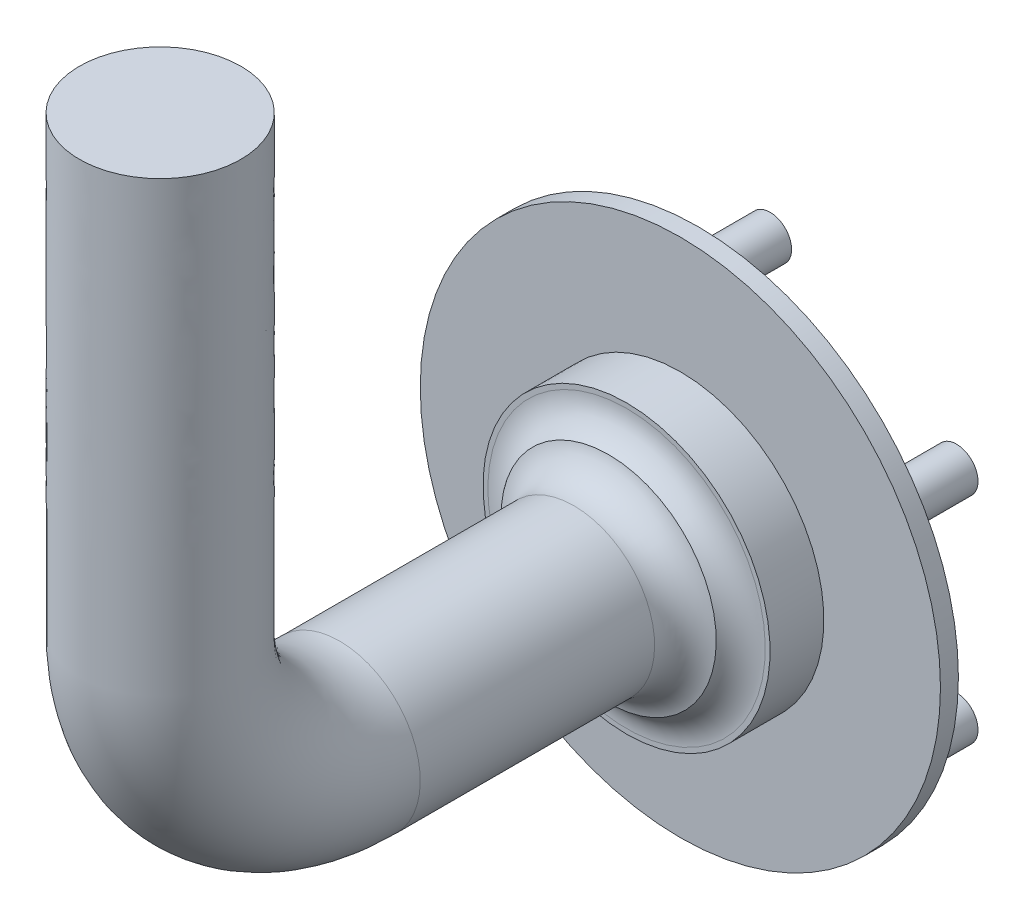
ISO-10303-21;
HEADER;
FILE_DESCRIPTION(('STEP AP214'),'2;1');
FILE_NAME('part.step','',(''),(''),'','','');
FILE_SCHEMA(('AUTOMOTIVE_DESIGN { 1 0 10303 214 1 1 1 1 }'));
ENDSEC;
DATA;
#1=APPLICATION_CONTEXT('core data for automotive mechanical design processes');
#2=APPLICATION_PROTOCOL_DEFINITION('international standard','automotive_design',2000,#1);
#3=PRODUCT_CONTEXT('',#1,'mechanical');
#4=PRODUCT('Part','Part','',(#3));
#5=PRODUCT_RELATED_PRODUCT_CATEGORY('part','',(#4));
#6=PRODUCT_DEFINITION_FORMATION('','',#4);
#7=PRODUCT_DEFINITION_CONTEXT('part definition',#1,'design');
#8=PRODUCT_DEFINITION('design','',#6,#7);
#9=PRODUCT_DEFINITION_SHAPE('','',#8);
#10=(LENGTH_UNIT() NAMED_UNIT(*) SI_UNIT(.MILLI.,.METRE.));
#11=(NAMED_UNIT(*) PLANE_ANGLE_UNIT() SI_UNIT($,.RADIAN.));
#12=(NAMED_UNIT(*) SI_UNIT($,.STERADIAN.) SOLID_ANGLE_UNIT());
#13=UNCERTAINTY_MEASURE_WITH_UNIT(LENGTH_MEASURE(1.E-05),#10,'distance_accuracy_value','');
#14=(GEOMETRIC_REPRESENTATION_CONTEXT(3) GLOBAL_UNCERTAINTY_ASSIGNED_CONTEXT((#13)) GLOBAL_UNIT_ASSIGNED_CONTEXT((#10,
#11,#12)) REPRESENTATION_CONTEXT('',''));
#15=CARTESIAN_POINT('',(0.,0.,0.));
#16=DIRECTION('',(0.,0.,1.));
#17=DIRECTION('',(1.,0.,0.));
#18=AXIS2_PLACEMENT_3D('',#15,#16,#17);
#19=CARTESIAN_POINT('',(0.,125.,50.));
#20=DIRECTION('',(0.,-1.,0.));
#21=DIRECTION('',(0.,0.,-1.));
#22=AXIS2_PLACEMENT_3D('',#19,#20,#21);
#23=PLANE('',#22);
#24=CARTESIAN_POINT('',(0.,125.,50.));
#25=DIRECTION('',(0.,-1.,0.));
#26=DIRECTION('',(0.,0.,-1.));
#27=AXIS2_PLACEMENT_3D('',#24,#25,#26);
#28=CIRCLE('',#27,22.5);
#29=CARTESIAN_POINT('',(0.,125.,27.5));
#30=VERTEX_POINT('',#29);
#31=EDGE_CURVE('E49',#30,#30,#28,.T.);
#32=ORIENTED_EDGE('',*,*,#31,.F.);
#33=EDGE_LOOP('',(#32));
#34=FACE_BOUND('',#33,.T.);
#35=ADVANCED_FACE('F32',(#34),#23,.F.);
#36=CARTESIAN_POINT('',(0.,125.,27.5));
#37=CARTESIAN_POINT('',(0.,104.166666666646,27.5));
#38=CARTESIAN_POINT('',(0.,83.3333333336014,27.5));
#39=CARTESIAN_POINT('',(0.,52.0833333331993,27.5));
#40=CARTESIAN_POINT('',(0.,41.6666666667103,27.5));
#41=CARTESIAN_POINT('',(0.,26.0416666666448,27.5));
#42=CARTESIAN_POINT('',(0.,20.8333333333371,27.5));
#43=CARTESIAN_POINT('',(0.,13.0208333333314,27.5));
#44=CARTESIAN_POINT('',(0.,10.4166666666652,27.5));
#45=CARTESIAN_POINT('',(0.,6.5104166666674,27.5));
#46=CARTESIAN_POINT('',(0.,5.20833333333313,27.5));
#47=CARTESIAN_POINT('',(0.,3.25520833333341,27.5));
#48=CARTESIAN_POINT('',(0.,2.60416666666628,27.5));
#49=CARTESIAN_POINT('',(0.,1.62760416666674,27.5));
#50=CARTESIAN_POINT('',(0.,1.30208333333319,27.5));
#51=CARTESIAN_POINT('',(0.,0.813802083333339,27.5));
#52=CARTESIAN_POINT('',(0.,0.651041666666746,27.5));
#53=CARTESIAN_POINT('',(0.,0.406901041666572,27.5));
#54=CARTESIAN_POINT('',(0.,0.325520833333337,27.5));
#55=CARTESIAN_POINT('',(0.,0.162760416666771,27.5));
#56=CARTESIAN_POINT('',(0.,0.0630696610081625,27.5000002237956));
#57=CARTESIAN_POINT('',(0.,-0.0396278367375316,27.4999998593851));
#58=CARTESIAN_POINT('',(0.,-0.0562458758030707,27.4999568598614));
#59=CARTESIAN_POINT('',(0.,-0.112491243460887,27.4997843012076));
#60=CARTESIAN_POINT('',(0.,-0.140613716436778,27.4996548826914));
#61=CARTESIAN_POINT('',(0.,-0.224980128554669,27.4991372133619));
#62=CARTESIAN_POINT('',(0.,-0.281223061212206,27.4986195484442));
#63=CARTESIAN_POINT('',(0.,-0.449944828544773,27.4965489393172));
#64=CARTESIAN_POINT('',(0.,-0.562416637010949,27.4944783753586));
#65=CARTESIAN_POINT('',(0.,-0.899779756035879,27.4861967324897));
#66=CARTESIAN_POINT('',(0.,-1.12461882110651,27.4779156101467));
#67=CARTESIAN_POINT('',(0.,-1.79873102724539,27.4447995397383));
#68=CARTESIAN_POINT('',(0.,-2.24759984205313,27.4116902453204));
#69=CARTESIAN_POINT('',(0.,-3.59099062462894,27.2793814987766));
#70=CARTESIAN_POINT('',(0.,-4.4822968534145,27.1471725723246));
#71=CARTESIAN_POINT('',(0.,-7.13035785950153,26.6204404886174));
#72=CARTESIAN_POINT('',(0.,-8.86093063837766,26.0954678623725));
#73=CARTESIAN_POINT('',(0.,-13.8495218933645,24.0291257074362));
#74=CARTESIAN_POINT('',(0.,-16.900034850488,21.9908381147607));
#75=CARTESIAN_POINT('',(0.,-21.9908381147721,16.9000348504994));
#76=CARTESIAN_POINT('',(0.,-24.0291257074362,13.8495218934043));
#77=CARTESIAN_POINT('',(0.,-26.0954678623725,8.86093063835785));
#78=CARTESIAN_POINT('',(0.,-26.6204404886285,7.13035785951691));
#79=CARTESIAN_POINT('',(0.,-27.147172572319,4.48229685340696));
#80=CARTESIAN_POINT('',(0.,-27.2793814987766,3.59099062464958));
#81=CARTESIAN_POINT('',(0.,-27.4116902453204,2.24759984204291));
#82=CARTESIAN_POINT('',(0.,-27.4447995397379,1.79873102724256));
#83=CARTESIAN_POINT('',(0.,-27.4779156101469,1.12461882110789));
#84=CARTESIAN_POINT('',(0.,-27.4861967324897,0.899779756033261));
#85=CARTESIAN_POINT('',(0.,-27.4944783753586,0.562416637012184));
#86=CARTESIAN_POINT('',(0.,-27.4965489393171,0.44994482854643));
#87=CARTESIAN_POINT('',(0.,-27.4986195484442,0.281223061211257));
#88=CARTESIAN_POINT('',(0.,-27.4991372133619,0.224980128555284));
#89=CARTESIAN_POINT('',(0.,-27.4996548826914,0.140613716436462));
#90=CARTESIAN_POINT('',(0.,-27.4997843012075,0.112491243461172));
#91=CARTESIAN_POINT('',(0.,-27.4999568598615,0.0562458758027345));
#92=CARTESIAN_POINT('',(0.,-27.5,0.0396278370203778));
#93=CARTESIAN_POINT('',(0.,-27.5,0.));
#94=CARTESIAN_POINT('',(45.,125.,27.5));
#95=CARTESIAN_POINT('',(45.,104.166666666646,27.5));
#96=CARTESIAN_POINT('',(45.,83.3333333336014,27.5));
#97=CARTESIAN_POINT('',(45.,52.0833333331993,27.5));
#98=CARTESIAN_POINT('',(45.,41.6666666667103,27.5));
#99=CARTESIAN_POINT('',(45.,26.0416666666448,27.5));
#100=CARTESIAN_POINT('',(45.,20.8333333333371,27.5));
#101=CARTESIAN_POINT('',(45.,13.0208333333314,27.5));
#102=CARTESIAN_POINT('',(45.,10.4166666666652,27.5));
#103=CARTESIAN_POINT('',(45.,6.5104166666674,27.5));
#104=CARTESIAN_POINT('',(45.,5.20833333333313,27.5));
#105=CARTESIAN_POINT('',(45.,3.25520833333341,27.5));
#106=CARTESIAN_POINT('',(45.,2.60416666666628,27.5));
#107=CARTESIAN_POINT('',(45.,1.62760416666674,27.5));
#108=CARTESIAN_POINT('',(45.,1.30208333333319,27.5));
#109=CARTESIAN_POINT('',(45.,0.813802083333339,27.5));
#110=CARTESIAN_POINT('',(45.,0.651041666666746,27.5));
#111=CARTESIAN_POINT('',(45.,0.406901041666572,27.5));
#112=CARTESIAN_POINT('',(45.,0.325520833333337,27.5));
#113=CARTESIAN_POINT('',(45.,0.162760416666771,27.5));
#114=CARTESIAN_POINT('',(45.,0.0630696610081625,27.5000002237956));
#115=CARTESIAN_POINT('',(45.,-0.0396278367375316,27.4999998593851));
#116=CARTESIAN_POINT('',(45.,-0.0562458758030707,27.4999568598614));
#117=CARTESIAN_POINT('',(45.,-0.112491243460887,27.4997843012076));
#118=CARTESIAN_POINT('',(45.,-0.140613716436778,27.4996548826914));
#119=CARTESIAN_POINT('',(45.,-0.22498012855467,27.4991372133619));
#120=CARTESIAN_POINT('',(45.,-0.281223061212206,27.4986195484442));
#121=CARTESIAN_POINT('',(45.,-0.449944828544773,27.4965489393172));
#122=CARTESIAN_POINT('',(45.,-0.562416637010949,27.4944783753586));
#123=CARTESIAN_POINT('',(45.,-0.899779756035879,27.4861967324897));
#124=CARTESIAN_POINT('',(45.,-1.12461882110651,27.4779156101467));
#125=CARTESIAN_POINT('',(45.,-1.79873102724539,27.4447995397383));
#126=CARTESIAN_POINT('',(45.,-2.24759984205313,27.4116902453204));
#127=CARTESIAN_POINT('',(45.,-3.59099062462894,27.2793814987766));
#128=CARTESIAN_POINT('',(45.,-4.4822968534145,27.1471725723246));
#129=CARTESIAN_POINT('',(45.,-7.13035785950153,26.6204404886174));
#130=CARTESIAN_POINT('',(45.,-8.86093063837766,26.0954678623725));
#131=CARTESIAN_POINT('',(45.,-13.8495218933645,24.0291257074362));
#132=CARTESIAN_POINT('',(45.,-16.900034850488,21.9908381147607));
#133=CARTESIAN_POINT('',(45.,-21.9908381147721,16.9000348504994));
#134=CARTESIAN_POINT('',(45.,-24.0291257074362,13.8495218934043));
#135=CARTESIAN_POINT('',(45.,-26.0954678623725,8.86093063835785));
#136=CARTESIAN_POINT('',(45.,-26.6204404886285,7.13035785951691));
#137=CARTESIAN_POINT('',(45.,-27.147172572319,4.48229685340696));
#138=CARTESIAN_POINT('',(45.,-27.2793814987766,3.59099062464958));
#139=CARTESIAN_POINT('',(45.,-27.4116902453204,2.24759984204291));
#140=CARTESIAN_POINT('',(45.,-27.4447995397379,1.79873102724256));
#141=CARTESIAN_POINT('',(45.,-27.4779156101469,1.12461882110789));
#142=CARTESIAN_POINT('',(45.,-27.4861967324897,0.899779756033261));
#143=CARTESIAN_POINT('',(45.,-27.4944783753586,0.562416637012184));
#144=CARTESIAN_POINT('',(45.,-27.4965489393171,0.44994482854643));
#145=CARTESIAN_POINT('',(45.,-27.4986195484442,0.281223061211257));
#146=CARTESIAN_POINT('',(45.,-27.4991372133619,0.224980128555284));
#147=CARTESIAN_POINT('',(45.,-27.4996548826914,0.140613716436462));
#148=CARTESIAN_POINT('',(45.,-27.4997843012075,0.112491243461172));
#149=CARTESIAN_POINT('',(45.,-27.4999568598615,0.0562458758027345));
#150=CARTESIAN_POINT('',(45.,-27.5,0.0396278370203778));
#151=CARTESIAN_POINT('',(45.,-27.5,0.));
#152=CARTESIAN_POINT('',(45.,125.,72.5));
#153=CARTESIAN_POINT('',(45.,104.166666666646,72.5));
#154=CARTESIAN_POINT('',(45.,83.3333333336014,72.5));
#155=CARTESIAN_POINT('',(45.,52.0833333331993,72.5));
#156=CARTESIAN_POINT('',(45.,41.6666666666742,72.5));
#157=CARTESIAN_POINT('',(45.,26.0416666666629,72.5));
#158=CARTESIAN_POINT('',(45.,20.8333333333371,72.5));
#159=CARTESIAN_POINT('',(45.,13.0208333333314,72.5));
#160=CARTESIAN_POINT('',(45.,10.4166666666674,72.5));
#161=CARTESIAN_POINT('',(45.,6.51041666666628,72.5));
#162=CARTESIAN_POINT('',(45.,5.20833333333314,72.5));
#163=CARTESIAN_POINT('',(45.,3.25520833333342,72.5));
#164=CARTESIAN_POINT('',(45.,2.60416666666615,72.5));
#165=CARTESIAN_POINT('',(45.,1.62760416666682,72.5));
#166=CARTESIAN_POINT('',(45.,1.30208333333323,72.5));
#167=CARTESIAN_POINT('',(45.,0.813802083333327,72.5));
#168=CARTESIAN_POINT('',(45.,0.651041666666743,72.5));
#169=CARTESIAN_POINT('',(45.,0.406901041666582,72.5));
#170=CARTESIAN_POINT('',(45.,0.325520833333343,72.5));
#171=CARTESIAN_POINT('',(45.,0.162760416666776,72.5));
#172=CARTESIAN_POINT('',(45.,0.0996907540215186,72.5000005900065));
#173=CARTESIAN_POINT('',(45.,-0.0626375480929595,72.499999629288));
#174=CARTESIAN_POINT('',(45.,-0.148284581662631,72.4998862669074));
#175=CARTESIAN_POINT('',(45.,-0.296567823669602,72.4994313395471));
#176=CARTESIAN_POINT('',(45.,-0.370708888787859,72.4990901452775));
#177=CARTESIAN_POINT('',(45.,-0.593129429825936,72.497725380681));
#178=CARTESIAN_POINT('',(45.,-0.741406252286714,72.4963606277158));
#179=CARTESIAN_POINT('',(45.,-1.1862181843453,72.49090174911));
#180=CARTESIAN_POINT('',(45.,-1.48273477030158,72.4854429895818));
#181=CARTESIAN_POINT('',(45.,-2.37214662954913,72.4636095674724));
#182=CARTESIAN_POINT('',(45.,-2.96490416473525,72.4417775176572));
#183=CARTESIAN_POINT('',(45.,-4.7421090718289,72.3544715138601));
#184=CARTESIAN_POINT('',(45.,-5.92549049268547,72.2671833740261));
#185=CARTESIAN_POINT('',(45.,-9.46715710129454,71.9183694058665));
#186=CARTESIAN_POINT('',(45.,-11.816964431729,71.5698185997544));
#187=CARTESIAN_POINT('',(45.,-18.7982161750497,70.1811612881938));
#188=CARTESIAN_POINT('',(45.,-23.3606353193644,68.7971425462548));
#189=CARTESIAN_POINT('',(45.,-36.5123759006778,63.3495132286954));
#190=CARTESIAN_POINT('',(45.,-44.5546373331038,57.9758459389002));
#191=CARTESIAN_POINT('',(45.,-57.9758459389456,44.5546373331492));
#192=CARTESIAN_POINT('',(45.,-63.3495132286953,36.5123759007801));
#193=CARTESIAN_POINT('',(45.,-68.7971425462548,23.3606353193135));
#194=CARTESIAN_POINT('',(45.,-70.1811612882081,18.7982161750888));
#195=CARTESIAN_POINT('',(45.,-71.5698185997472,11.8169644317099));
#196=CARTESIAN_POINT('',(45.,-71.9183694058664,9.46715710134794));
#197=CARTESIAN_POINT('',(45.,-72.267183374026,5.92549049265907));
#198=CARTESIAN_POINT('',(45.,-72.3544715138592,4.74210907182144));
#199=CARTESIAN_POINT('',(45.,-72.4417775176577,2.96490416473892));
#200=CARTESIAN_POINT('',(45.,-72.4636095674724,2.37214662954229));
#201=CARTESIAN_POINT('',(45.,-72.4854429895818,1.48273477030484));
#202=CARTESIAN_POINT('',(45.,-72.49090174911,1.18621818434969));
#203=CARTESIAN_POINT('',(45.,-72.4963606277159,0.74140625228423));
#204=CARTESIAN_POINT('',(45.,-72.497725380681,0.593129429827581));
#205=CARTESIAN_POINT('',(45.,-72.4990901452775,0.370708888787045));
#206=CARTESIAN_POINT('',(45.,-72.4994313395471,0.296567823670372));
#207=CARTESIAN_POINT('',(45.,-72.4998862669074,0.148284581661765));
#208=CARTESIAN_POINT('',(45.,-72.5,0.0626375488386688));
#209=CARTESIAN_POINT('',(45.,-72.5,0.));
#210=CARTESIAN_POINT('',(0.,125.,72.5));
#211=CARTESIAN_POINT('',(0.,104.166666666646,72.5));
#212=CARTESIAN_POINT('',(0.,83.3333333336014,72.5));
#213=CARTESIAN_POINT('',(0.,52.0833333331993,72.5));
#214=CARTESIAN_POINT('',(0.,41.6666666666742,72.5));
#215=CARTESIAN_POINT('',(0.,26.0416666666629,72.5));
#216=CARTESIAN_POINT('',(0.,20.8333333333371,72.5));
#217=CARTESIAN_POINT('',(0.,13.0208333333314,72.5));
#218=CARTESIAN_POINT('',(0.,10.4166666666674,72.5));
#219=CARTESIAN_POINT('',(0.,6.51041666666628,72.5));
#220=CARTESIAN_POINT('',(0.,5.20833333333314,72.5));
#221=CARTESIAN_POINT('',(0.,3.25520833333342,72.5));
#222=CARTESIAN_POINT('',(0.,2.60416666666615,72.5));
#223=CARTESIAN_POINT('',(0.,1.62760416666682,72.5));
#224=CARTESIAN_POINT('',(0.,1.30208333333323,72.5));
#225=CARTESIAN_POINT('',(0.,0.813802083333327,72.5));
#226=CARTESIAN_POINT('',(0.,0.651041666666743,72.5));
#227=CARTESIAN_POINT('',(0.,0.406901041666582,72.5));
#228=CARTESIAN_POINT('',(0.,0.325520833333343,72.5));
#229=CARTESIAN_POINT('',(0.,0.162760416666776,72.5));
#230=CARTESIAN_POINT('',(0.,0.0996907540215186,72.5000005900065));
#231=CARTESIAN_POINT('',(0.,-0.0626375480929595,72.499999629288));
#232=CARTESIAN_POINT('',(0.,-0.148284581662631,72.4998862669074));
#233=CARTESIAN_POINT('',(0.,-0.296567823669602,72.4994313395471));
#234=CARTESIAN_POINT('',(0.,-0.370708888787859,72.4990901452775));
#235=CARTESIAN_POINT('',(0.,-0.593129429825936,72.497725380681));
#236=CARTESIAN_POINT('',(0.,-0.741406252286714,72.4963606277158));
#237=CARTESIAN_POINT('',(0.,-1.1862181843453,72.49090174911));
#238=CARTESIAN_POINT('',(0.,-1.48273477030158,72.4854429895818));
#239=CARTESIAN_POINT('',(0.,-2.37214662954913,72.4636095674724));
#240=CARTESIAN_POINT('',(0.,-2.96490416473525,72.4417775176572));
#241=CARTESIAN_POINT('',(0.,-4.7421090718289,72.3544715138601));
#242=CARTESIAN_POINT('',(0.,-5.92549049268547,72.2671833740261));
#243=CARTESIAN_POINT('',(0.,-9.46715710129454,71.9183694058665));
#244=CARTESIAN_POINT('',(0.,-11.816964431729,71.5698185997544));
#245=CARTESIAN_POINT('',(0.,-18.7982161750497,70.1811612881938));
#246=CARTESIAN_POINT('',(0.,-23.3606353193644,68.7971425462548));
#247=CARTESIAN_POINT('',(0.,-36.5123759006778,63.3495132286954));
#248=CARTESIAN_POINT('',(0.,-44.5546373331038,57.9758459389002));
#249=CARTESIAN_POINT('',(0.,-57.9758459389456,44.5546373331492));
#250=CARTESIAN_POINT('',(0.,-63.3495132286953,36.5123759007801));
#251=CARTESIAN_POINT('',(0.,-68.7971425462548,23.3606353193135));
#252=CARTESIAN_POINT('',(0.,-70.1811612882081,18.7982161750888));
#253=CARTESIAN_POINT('',(0.,-71.5698185997472,11.8169644317099));
#254=CARTESIAN_POINT('',(0.,-71.9183694058664,9.46715710134794));
#255=CARTESIAN_POINT('',(0.,-72.267183374026,5.92549049265906));
#256=CARTESIAN_POINT('',(0.,-72.3544715138592,4.74210907182144));
#257=CARTESIAN_POINT('',(0.,-72.4417775176577,2.96490416473892));
#258=CARTESIAN_POINT('',(0.,-72.4636095674724,2.37214662954229));
#259=CARTESIAN_POINT('',(0.,-72.4854429895818,1.48273477030484));
#260=CARTESIAN_POINT('',(0.,-72.49090174911,1.18621818434969));
#261=CARTESIAN_POINT('',(0.,-72.4963606277159,0.74140625228423));
#262=CARTESIAN_POINT('',(0.,-72.497725380681,0.593129429827581));
#263=CARTESIAN_POINT('',(0.,-72.4990901452775,0.370708888787045));
#264=CARTESIAN_POINT('',(0.,-72.4994313395471,0.296567823670372));
#265=CARTESIAN_POINT('',(0.,-72.4998862669074,0.148284581661765));
#266=CARTESIAN_POINT('',(0.,-72.5,0.0626375488386688));
#267=CARTESIAN_POINT('',(0.,-72.5,0.));
#268=CARTESIAN_POINT('',(-45.,125.,72.5));
#269=CARTESIAN_POINT('',(-45.,104.166666666646,72.5));
#270=CARTESIAN_POINT('',(-45.,83.3333333336014,72.5));
#271=CARTESIAN_POINT('',(-45.,52.0833333331993,72.5));
#272=CARTESIAN_POINT('',(-45.,41.6666666666742,72.5));
#273=CARTESIAN_POINT('',(-45.,26.0416666666629,72.5));
#274=CARTESIAN_POINT('',(-45.,20.8333333333371,72.5));
#275=CARTESIAN_POINT('',(-45.,13.0208333333314,72.5));
#276=CARTESIAN_POINT('',(-45.,10.4166666666674,72.5));
#277=CARTESIAN_POINT('',(-45.,6.51041666666628,72.5));
#278=CARTESIAN_POINT('',(-45.,5.20833333333314,72.5));
#279=CARTESIAN_POINT('',(-45.,3.25520833333342,72.5));
#280=CARTESIAN_POINT('',(-45.,2.60416666666615,72.5));
#281=CARTESIAN_POINT('',(-45.,1.62760416666682,72.5));
#282=CARTESIAN_POINT('',(-45.,1.30208333333323,72.5));
#283=CARTESIAN_POINT('',(-45.,0.813802083333327,72.5));
#284=CARTESIAN_POINT('',(-45.,0.651041666666743,72.5));
#285=CARTESIAN_POINT('',(-45.,0.406901041666582,72.5));
#286=CARTESIAN_POINT('',(-45.,0.325520833333343,72.5));
#287=CARTESIAN_POINT('',(-45.,0.162760416666776,72.5));
#288=CARTESIAN_POINT('',(-45.,0.0996907540215186,72.5000005900065));
#289=CARTESIAN_POINT('',(-45.,-0.0626375480929595,72.499999629288));
#290=CARTESIAN_POINT('',(-45.,-0.148284581662631,72.4998862669074));
#291=CARTESIAN_POINT('',(-45.,-0.296567823669602,72.4994313395471));
#292=CARTESIAN_POINT('',(-45.,-0.370708888787859,72.4990901452775));
#293=CARTESIAN_POINT('',(-45.,-0.593129429825936,72.497725380681));
#294=CARTESIAN_POINT('',(-45.,-0.741406252286714,72.4963606277158));
#295=CARTESIAN_POINT('',(-45.,-1.1862181843453,72.49090174911));
#296=CARTESIAN_POINT('',(-45.,-1.48273477030158,72.4854429895818));
#297=CARTESIAN_POINT('',(-45.,-2.37214662954913,72.4636095674724));
#298=CARTESIAN_POINT('',(-45.,-2.96490416473525,72.4417775176572));
#299=CARTESIAN_POINT('',(-45.,-4.7421090718289,72.3544715138601));
#300=CARTESIAN_POINT('',(-45.,-5.92549049268547,72.2671833740261));
#301=CARTESIAN_POINT('',(-45.,-9.46715710129454,71.9183694058665));
#302=CARTESIAN_POINT('',(-45.,-11.816964431729,71.5698185997544));
#303=CARTESIAN_POINT('',(-45.,-18.7982161750497,70.1811612881938));
#304=CARTESIAN_POINT('',(-45.,-23.3606353193644,68.7971425462548));
#305=CARTESIAN_POINT('',(-45.,-36.5123759006778,63.3495132286954));
#306=CARTESIAN_POINT('',(-45.,-44.5546373331038,57.9758459389002));
#307=CARTESIAN_POINT('',(-45.,-57.9758459389456,44.5546373331492));
#308=CARTESIAN_POINT('',(-45.,-63.3495132286953,36.5123759007801));
#309=CARTESIAN_POINT('',(-45.,-68.7971425462548,23.3606353193135));
#310=CARTESIAN_POINT('',(-45.,-70.1811612882081,18.7982161750888));
#311=CARTESIAN_POINT('',(-45.,-71.5698185997472,11.8169644317099));
#312=CARTESIAN_POINT('',(-45.,-71.9183694058664,9.46715710134794));
#313=CARTESIAN_POINT('',(-45.,-72.267183374026,5.92549049265907));
#314=CARTESIAN_POINT('',(-45.,-72.3544715138592,4.74210907182144));
#315=CARTESIAN_POINT('',(-45.,-72.4417775176577,2.96490416473892));
#316=CARTESIAN_POINT('',(-45.,-72.4636095674724,2.37214662954229));
#317=CARTESIAN_POINT('',(-45.,-72.4854429895818,1.48273477030484));
#318=CARTESIAN_POINT('',(-45.,-72.49090174911,1.18621818434969));
#319=CARTESIAN_POINT('',(-45.,-72.4963606277159,0.74140625228423));
#320=CARTESIAN_POINT('',(-45.,-72.497725380681,0.593129429827581));
#321=CARTESIAN_POINT('',(-45.,-72.4990901452775,0.370708888787045));
#322=CARTESIAN_POINT('',(-45.,-72.4994313395471,0.296567823670372));
#323=CARTESIAN_POINT('',(-45.,-72.4998862669074,0.148284581661765));
#324=CARTESIAN_POINT('',(-45.,-72.5,0.0626375488386688));
#325=CARTESIAN_POINT('',(-45.,-72.5,0.));
#326=CARTESIAN_POINT('',(-45.,125.,27.5));
#327=CARTESIAN_POINT('',(-45.,104.166666666646,27.5));
#328=CARTESIAN_POINT('',(-45.,83.3333333336014,27.5));
#329=CARTESIAN_POINT('',(-45.,52.0833333331993,27.5));
#330=CARTESIAN_POINT('',(-45.,41.6666666667103,27.5));
#331=CARTESIAN_POINT('',(-45.,26.0416666666448,27.5));
#332=CARTESIAN_POINT('',(-45.,20.8333333333371,27.5));
#333=CARTESIAN_POINT('',(-45.,13.0208333333314,27.5));
#334=CARTESIAN_POINT('',(-45.,10.4166666666652,27.5));
#335=CARTESIAN_POINT('',(-45.,6.5104166666674,27.5));
#336=CARTESIAN_POINT('',(-45.,5.20833333333313,27.5));
#337=CARTESIAN_POINT('',(-45.,3.25520833333341,27.5));
#338=CARTESIAN_POINT('',(-45.,2.60416666666628,27.5));
#339=CARTESIAN_POINT('',(-45.,1.62760416666674,27.5));
#340=CARTESIAN_POINT('',(-45.,1.30208333333319,27.5));
#341=CARTESIAN_POINT('',(-45.,0.813802083333339,27.5));
#342=CARTESIAN_POINT('',(-45.,0.651041666666746,27.5));
#343=CARTESIAN_POINT('',(-45.,0.406901041666572,27.5));
#344=CARTESIAN_POINT('',(-45.,0.325520833333337,27.5));
#345=CARTESIAN_POINT('',(-45.,0.162760416666771,27.5));
#346=CARTESIAN_POINT('',(-45.,0.0630696610081625,27.5000002237956));
#347=CARTESIAN_POINT('',(-45.,-0.0396278367375316,27.4999998593851));
#348=CARTESIAN_POINT('',(-45.,-0.0562458758030707,27.4999568598614));
#349=CARTESIAN_POINT('',(-45.,-0.112491243460887,27.4997843012076));
#350=CARTESIAN_POINT('',(-45.,-0.140613716436778,27.4996548826914));
#351=CARTESIAN_POINT('',(-45.,-0.22498012855467,27.4991372133619));
#352=CARTESIAN_POINT('',(-45.,-0.281223061212206,27.4986195484442));
#353=CARTESIAN_POINT('',(-45.,-0.449944828544773,27.4965489393172));
#354=CARTESIAN_POINT('',(-45.,-0.562416637010949,27.4944783753586));
#355=CARTESIAN_POINT('',(-45.,-0.899779756035879,27.4861967324897));
#356=CARTESIAN_POINT('',(-45.,-1.12461882110651,27.4779156101467));
#357=CARTESIAN_POINT('',(-45.,-1.79873102724539,27.4447995397383));
#358=CARTESIAN_POINT('',(-45.,-2.24759984205313,27.4116902453204));
#359=CARTESIAN_POINT('',(-45.,-3.59099062462894,27.2793814987766));
#360=CARTESIAN_POINT('',(-45.,-4.4822968534145,27.1471725723246));
#361=CARTESIAN_POINT('',(-45.,-7.13035785950153,26.6204404886174));
#362=CARTESIAN_POINT('',(-45.,-8.86093063837766,26.0954678623725));
#363=CARTESIAN_POINT('',(-45.,-13.8495218933645,24.0291257074362));
#364=CARTESIAN_POINT('',(-45.,-16.900034850488,21.9908381147607));
#365=CARTESIAN_POINT('',(-45.,-21.9908381147721,16.9000348504994));
#366=CARTESIAN_POINT('',(-45.,-24.0291257074362,13.8495218934043));
#367=CARTESIAN_POINT('',(-45.,-26.0954678623725,8.86093063835785));
#368=CARTESIAN_POINT('',(-45.,-26.6204404886285,7.13035785951691));
#369=CARTESIAN_POINT('',(-45.,-27.147172572319,4.48229685340696));
#370=CARTESIAN_POINT('',(-45.,-27.2793814987766,3.59099062464958));
#371=CARTESIAN_POINT('',(-45.,-27.4116902453204,2.24759984204291));
#372=CARTESIAN_POINT('',(-45.,-27.4447995397379,1.79873102724256));
#373=CARTESIAN_POINT('',(-45.,-27.4779156101469,1.12461882110789));
#374=CARTESIAN_POINT('',(-45.,-27.4861967324897,0.899779756033261));
#375=CARTESIAN_POINT('',(-45.,-27.4944783753586,0.562416637012184));
#376=CARTESIAN_POINT('',(-45.,-27.4965489393171,0.44994482854643));
#377=CARTESIAN_POINT('',(-45.,-27.4986195484442,0.281223061211257));
#378=CARTESIAN_POINT('',(-45.,-27.4991372133619,0.224980128555284));
#379=CARTESIAN_POINT('',(-45.,-27.4996548826914,0.140613716436462));
#380=CARTESIAN_POINT('',(-45.,-27.4997843012075,0.112491243461172));
#381=CARTESIAN_POINT('',(-45.,-27.4999568598615,0.0562458758027345));
#382=CARTESIAN_POINT('',(-45.,-27.5,0.0396278370203778));
#383=CARTESIAN_POINT('',(-45.,-27.5,0.));
#384=CARTESIAN_POINT('',(0.,125.,27.5));
#385=CARTESIAN_POINT('',(0.,104.166666666646,27.5));
#386=CARTESIAN_POINT('',(0.,83.3333333336014,27.5));
#387=CARTESIAN_POINT('',(0.,52.0833333331993,27.5));
#388=CARTESIAN_POINT('',(0.,41.6666666667103,27.5));
#389=CARTESIAN_POINT('',(0.,26.0416666666448,27.5));
#390=CARTESIAN_POINT('',(0.,20.8333333333371,27.5));
#391=CARTESIAN_POINT('',(0.,13.0208333333314,27.5));
#392=CARTESIAN_POINT('',(0.,10.4166666666652,27.5));
#393=CARTESIAN_POINT('',(0.,6.5104166666674,27.5));
#394=CARTESIAN_POINT('',(0.,5.20833333333313,27.5));
#395=CARTESIAN_POINT('',(0.,3.25520833333341,27.5));
#396=CARTESIAN_POINT('',(0.,2.60416666666628,27.5));
#397=CARTESIAN_POINT('',(0.,1.62760416666674,27.5));
#398=CARTESIAN_POINT('',(0.,1.30208333333319,27.5));
#399=CARTESIAN_POINT('',(0.,0.813802083333339,27.5));
#400=CARTESIAN_POINT('',(0.,0.651041666666746,27.5));
#401=CARTESIAN_POINT('',(0.,0.406901041666572,27.5));
#402=CARTESIAN_POINT('',(0.,0.325520833333337,27.5));
#403=CARTESIAN_POINT('',(0.,0.162760416666771,27.5));
#404=CARTESIAN_POINT('',(0.,0.0630696610081625,27.5000002237956));
#405=CARTESIAN_POINT('',(0.,-0.0396278367375316,27.4999998593851));
#406=CARTESIAN_POINT('',(0.,-0.0562458758030707,27.4999568598614));
#407=CARTESIAN_POINT('',(0.,-0.112491243460887,27.4997843012076));
#408=CARTESIAN_POINT('',(0.,-0.140613716436778,27.4996548826914));
#409=CARTESIAN_POINT('',(0.,-0.224980128554669,27.4991372133619));
#410=CARTESIAN_POINT('',(0.,-0.281223061212206,27.4986195484442));
#411=CARTESIAN_POINT('',(0.,-0.449944828544773,27.4965489393172));
#412=CARTESIAN_POINT('',(0.,-0.562416637010949,27.4944783753586));
#413=CARTESIAN_POINT('',(0.,-0.899779756035879,27.4861967324897));
#414=CARTESIAN_POINT('',(0.,-1.12461882110651,27.4779156101467));
#415=CARTESIAN_POINT('',(0.,-1.79873102724539,27.4447995397383));
#416=CARTESIAN_POINT('',(0.,-2.24759984205313,27.4116902453204));
#417=CARTESIAN_POINT('',(0.,-3.59099062462894,27.2793814987766));
#418=CARTESIAN_POINT('',(0.,-4.4822968534145,27.1471725723246));
#419=CARTESIAN_POINT('',(0.,-7.13035785950153,26.6204404886174));
#420=CARTESIAN_POINT('',(0.,-8.86093063837766,26.0954678623725));
#421=CARTESIAN_POINT('',(0.,-13.8495218933645,24.0291257074362));
#422=CARTESIAN_POINT('',(0.,-16.900034850488,21.9908381147607));
#423=CARTESIAN_POINT('',(0.,-21.9908381147721,16.9000348504994));
#424=CARTESIAN_POINT('',(0.,-24.0291257074362,13.8495218934043));
#425=CARTESIAN_POINT('',(0.,-26.0954678623725,8.86093063835785));
#426=CARTESIAN_POINT('',(0.,-26.6204404886285,7.13035785951691));
#427=CARTESIAN_POINT('',(0.,-27.147172572319,4.48229685340696));
#428=CARTESIAN_POINT('',(0.,-27.2793814987766,3.59099062464958));
#429=CARTESIAN_POINT('',(0.,-27.4116902453204,2.24759984204291));
#430=CARTESIAN_POINT('',(0.,-27.4447995397379,1.79873102724256));
#431=CARTESIAN_POINT('',(0.,-27.4779156101469,1.12461882110789));
#432=CARTESIAN_POINT('',(0.,-27.4861967324897,0.899779756033261));
#433=CARTESIAN_POINT('',(0.,-27.4944783753586,0.562416637012184));
#434=CARTESIAN_POINT('',(0.,-27.4965489393171,0.44994482854643));
#435=CARTESIAN_POINT('',(0.,-27.4986195484442,0.281223061211257));
#436=CARTESIAN_POINT('',(0.,-27.4991372133619,0.224980128555284));
#437=CARTESIAN_POINT('',(0.,-27.4996548826914,0.140613716436462));
#438=CARTESIAN_POINT('',(0.,-27.4997843012075,0.112491243461172));
#439=CARTESIAN_POINT('',(0.,-27.4999568598615,0.0562458758027345));
#440=CARTESIAN_POINT('',(0.,-27.5,0.0396278370203778));
#441=CARTESIAN_POINT('',(0.,-27.5,0.));
#442=(BOUNDED_SURFACE() B_SPLINE_SURFACE(3,3,((#36,#37,#38,#39,#40,#41,#42,#43,#44,#45,#46,#47,
#48,#49,#50,#51,#52,#53,#54,#55,#56,#57,#58,#59,#60,#61,#62,#63,#64,#65,#66,#67,#68,#69,#70,#71,
#72,#73,#74,#75,#76,#77,#78,#79,#80,#81,#82,#83,#84,#85,#86,#87,#88,#89,#90,#91,#92,#93),(#94,
#95,#96,#97,#98,#99,#100,#101,#102,#103,#104,#105,#106,#107,#108,#109,#110,#111,#112,#113,#114,
#115,#116,#117,#118,#119,#120,#121,#122,#123,#124,#125,#126,#127,#128,#129,#130,#131,#132,#133,
#134,#135,#136,#137,#138,#139,#140,#141,#142,#143,#144,#145,#146,#147,#148,#149,#150,#151),
(#152,#153,#154,#155,#156,#157,#158,#159,#160,#161,#162,#163,#164,#165,#166,#167,#168,#169,#170,
#171,#172,#173,#174,#175,#176,#177,#178,#179,#180,#181,#182,#183,#184,#185,#186,#187,#188,#189,
#190,#191,#192,#193,#194,#195,#196,#197,#198,#199,#200,#201,#202,#203,#204,#205,#206,#207,#208,
#209),(#210,#211,#212,#213,#214,#215,#216,#217,#218,#219,#220,#221,#222,#223,#224,#225,#226,
#227,#228,#229,#230,#231,#232,#233,#234,#235,#236,#237,#238,#239,#240,#241,#242,#243,#244,#245,
#246,#247,#248,#249,#250,#251,#252,#253,#254,#255,#256,#257,#258,#259,#260,#261,#262,#263,#264,
#265,#266,#267),(#268,#269,#270,#271,#272,#273,#274,#275,#276,#277,#278,#279,#280,#281,#282,
#283,#284,#285,#286,#287,#288,#289,#290,#291,#292,#293,#294,#295,#296,#297,#298,#299,#300,#301,
#302,#303,#304,#305,#306,#307,#308,#309,#310,#311,#312,#313,#314,#315,#316,#317,#318,#319,#320,
#321,#322,#323,#324,#325),(#326,#327,#328,#329,#330,#331,#332,#333,#334,#335,#336,#337,#338,
#339,#340,#341,#342,#343,#344,#345,#346,#347,#348,#349,#350,#351,#352,#353,#354,#355,#356,#357,
#358,#359,#360,#361,#362,#363,#364,#365,#366,#367,#368,#369,#370,#371,#372,#373,#374,#375,#376,
#377,#378,#379,#380,#381,#382,#383),(#384,#385,#386,#387,#388,#389,#390,#391,#392,#393,#394,
#395,#396,#397,#398,#399,#400,#401,#402,#403,#404,#405,#406,#407,#408,#409,#410,#411,#412,#413,
#414,#415,#416,#417,#418,#419,#420,#421,#422,#423,#424,#425,#426,#427,#428,#429,#430,#431,#432,
#433,#434,#435,#436,#437,#438,#439,#440,#441)),.UNSPECIFIED.,.T.,.F.,
.F.) B_SPLINE_SURFACE_WITH_KNOTS((4,3,4),(4,2,2,2,2,2,2,2,2,2,2,2,2,2,2,2,2,2,2,2,2,2,2,2,2,2,2,
2,4),(0.,0.5,1.),(0.,0.224384437461417,0.336576656192125,0.392672765557479,0.420720820240157,
0.434744847581495,0.441756861252164,0.445262868087499,0.447015871505166,0.447892373214,
0.448768874922834,0.4493195971887,0.449870319454566,0.450971763986298,0.453174653049763,
0.457580431176692,0.46639198743055,0.484015099938267,0.5192613249537,0.589753774984567,
0.660246225015433,0.695492450030867,0.713115562538583,0.721927118792441,0.726332896919371,
0.728535785982835,0.729637230514568,0.730187952780434,0.7307386750463),
.UNSPECIFIED.) GEOMETRIC_REPRESENTATION_ITEM() RATIONAL_B_SPLINE_SURFACE(((1.,1.,1.,1.,1.,1.,1.,
1.,1.,1.,1.,1.,1.,1.,1.,1.,1.,1.,1.,1.,1.,1.,1.,1.,1.,1.,1.,1.,1.,1.,1.,1.,1.,1.,1.,1.,1.,1.,1.,
1.,1.,1.,1.,1.,1.,1.,1.,1.,1.,1.,1.,1.,1.,1.,1.,1.,1.,1.),(0.333333333333333,0.333333333333333,
0.333333333333333,0.333333333333333,0.333333333333333,0.333333333333333,0.333333333333333,
0.333333333333333,0.333333333333333,0.333333333333333,0.333333333333333,0.333333333333333,
0.333333333333333,0.333333333333333,0.333333333333333,0.333333333333333,0.333333333333333,
0.333333333333333,0.333333333333333,0.333333333333333,0.333333333333333,0.333333333333333,
0.333333333333333,0.333333333333333,0.333333333333333,0.333333333333333,0.333333333333333,
0.333333333333333,0.333333333333333,0.333333333333333,0.333333333333333,0.333333333333333,
0.333333333333333,0.333333333333333,0.333333333333333,0.333333333333333,0.333333333333333,
0.333333333333333,0.333333333333333,0.333333333333333,0.333333333333333,0.333333333333333,
0.333333333333333,0.333333333333333,0.333333333333333,0.333333333333333,0.333333333333333,
0.333333333333333,0.333333333333333,0.333333333333333,0.333333333333333,0.333333333333333,
0.333333333333333,0.333333333333333,0.333333333333333,0.333333333333333,0.333333333333333,
0.333333333333333),(0.333333333333333,0.333333333333333,0.333333333333333,0.333333333333333,
0.333333333333333,0.333333333333333,0.333333333333333,0.333333333333333,0.333333333333333,
0.333333333333333,0.333333333333333,0.333333333333333,0.333333333333333,0.333333333333333,
0.333333333333333,0.333333333333333,0.333333333333333,0.333333333333333,0.333333333333333,
0.333333333333333,0.333333333333333,0.333333333333333,0.333333333333333,0.333333333333333,
0.333333333333333,0.333333333333333,0.333333333333333,0.333333333333333,0.333333333333333,
0.333333333333333,0.333333333333333,0.333333333333333,0.333333333333333,0.333333333333333,
0.333333333333333,0.333333333333333,0.333333333333333,0.333333333333333,0.333333333333333,
0.333333333333333,0.333333333333333,0.333333333333333,0.333333333333333,0.333333333333333,
0.333333333333333,0.333333333333333,0.333333333333333,0.333333333333333,0.333333333333333,
0.333333333333333,0.333333333333333,0.333333333333333,0.333333333333333,0.333333333333333,
0.333333333333333,0.333333333333333,0.333333333333333,0.333333333333333),(1.,1.,1.,1.,1.,1.,1.,
1.,1.,1.,1.,1.,1.,1.,1.,1.,1.,1.,1.,1.,1.,1.,1.,1.,1.,1.,1.,1.,1.,1.,1.,1.,1.,1.,1.,1.,1.,1.,1.,
1.,1.,1.,1.,1.,1.,1.,1.,1.,1.,1.,1.,1.,1.,1.,1.,1.,1.,1.),(0.333333333333333,0.333333333333333,
0.333333333333333,0.333333333333333,0.333333333333333,0.333333333333333,0.333333333333333,
0.333333333333333,0.333333333333333,0.333333333333333,0.333333333333333,0.333333333333333,
0.333333333333333,0.333333333333333,0.333333333333333,0.333333333333333,0.333333333333333,
0.333333333333333,0.333333333333333,0.333333333333333,0.333333333333333,0.333333333333333,
0.333333333333333,0.333333333333333,0.333333333333333,0.333333333333333,0.333333333333333,
0.333333333333333,0.333333333333333,0.333333333333333,0.333333333333333,0.333333333333333,
0.333333333333333,0.333333333333333,0.333333333333333,0.333333333333333,0.333333333333333,
0.333333333333333,0.333333333333333,0.333333333333333,0.333333333333333,0.333333333333333,
0.333333333333333,0.333333333333333,0.333333333333333,0.333333333333333,0.333333333333333,
0.333333333333333,0.333333333333333,0.333333333333333,0.333333333333333,0.333333333333333,
0.333333333333333,0.333333333333333,0.333333333333333,0.333333333333333,0.333333333333333,
0.333333333333333),(0.333333333333333,0.333333333333333,0.333333333333333,0.333333333333333,
0.333333333333333,0.333333333333333,0.333333333333333,0.333333333333333,0.333333333333333,
0.333333333333333,0.333333333333333,0.333333333333333,0.333333333333333,0.333333333333333,
0.333333333333333,0.333333333333333,0.333333333333333,0.333333333333333,0.333333333333333,
0.333333333333333,0.333333333333333,0.333333333333333,0.333333333333333,0.333333333333333,
0.333333333333333,0.333333333333333,0.333333333333333,0.333333333333333,0.333333333333333,
0.333333333333333,0.333333333333333,0.333333333333333,0.333333333333333,0.333333333333333,
0.333333333333333,0.333333333333333,0.333333333333333,0.333333333333333,0.333333333333333,
0.333333333333333,0.333333333333333,0.333333333333333,0.333333333333333,0.333333333333333,
0.333333333333333,0.333333333333333,0.333333333333333,0.333333333333333,0.333333333333333,
0.333333333333333,0.333333333333333,0.333333333333333,0.333333333333333,0.333333333333333,
0.333333333333333,0.333333333333333,0.333333333333333,0.333333333333333),(1.,1.,1.,1.,1.,1.,1.,
1.,1.,1.,1.,1.,1.,1.,1.,1.,1.,1.,1.,1.,1.,1.,1.,1.,1.,1.,1.,1.,1.,1.,1.,1.,1.,1.,1.,1.,1.,1.,1.,
1.,1.,1.,1.,1.,1.,1.,1.,1.,1.,1.,1.,1.,1.,1.,1.,1.,1.,1.))) REPRESENTATION_ITEM('') SURFACE());
#443=CARTESIAN_POINT('',(0.,-50.,0.));
#444=DIRECTION('',(0.,0.,-1.));
#445=DIRECTION('',(0.,1.,0.));
#446=AXIS2_PLACEMENT_3D('',#443,#444,#445);
#447=CIRCLE('',#446,22.5);
#448=CARTESIAN_POINT('',(0.,-27.5,0.));
#449=VERTEX_POINT('',#448);
#450=EDGE_CURVE('E44',#449,#449,#447,.T.);
#451=ORIENTED_EDGE('',*,*,#450,.F.);
#452=EDGE_LOOP('',(#451));
#453=FACE_BOUND('',#452,.T.);
#454=ORIENTED_EDGE('',*,*,#31,.T.);
#455=EDGE_LOOP('',(#454));
#456=FACE_BOUND('',#455,.T.);
#457=ADVANCED_FACE('F145',(#453,#456),#442,.T.);
#458=CARTESIAN_POINT('',(0.,-50.,0.));
#459=DIRECTION('',(0.,0.,-1.));
#460=DIRECTION('',(-1.,0.,0.));
#461=AXIS2_PLACEMENT_3D('',#458,#459,#460);
#462=CYLINDRICAL_SURFACE('',#461,22.5);
#463=CARTESIAN_POINT('',(0.,-50.,-65.3175416344814));
#464=DIRECTION('',(0.,0.,-1.));
#465=DIRECTION('',(0.,1.,0.));
#466=AXIS2_PLACEMENT_3D('',#463,#464,#465);
#467=CIRCLE('',#466,22.5);
#468=CARTESIAN_POINT('',(0.,-27.5,-65.3175416344814));
#469=VERTEX_POINT('',#468);
#470=EDGE_CURVE('E10',#469,#469,#467,.F.);
#471=ORIENTED_EDGE('',*,*,#470,.T.);
#472=EDGE_LOOP('',(#471));
#473=FACE_BOUND('',#472,.T.);
#474=ORIENTED_EDGE('',*,*,#450,.T.);
#475=EDGE_LOOP('',(#474));
#476=FACE_BOUND('',#475,.T.);
#477=ADVANCED_FACE('F142',(#473,#476),#462,.T.);
#478=CARTESIAN_POINT('',(0.,-50.,-95.));
#479=DIRECTION('',(0.,0.,1.));
#480=DIRECTION('',(0.,-1.,0.));
#481=AXIS2_PLACEMENT_3D('',#478,#479,#480);
#482=CYLINDRICAL_SURFACE('',#481,40.);
#483=CARTESIAN_POINT('',(0.,-50.,-95.));
#484=DIRECTION('',(0.,0.,-1.));
#485=DIRECTION('',(0.,1.,0.));
#486=AXIS2_PLACEMENT_3D('',#483,#484,#485);
#487=CIRCLE('',#486,40.);
#488=CARTESIAN_POINT('',(0.,-10.,-95.));
#489=VERTEX_POINT('',#488);
#490=EDGE_CURVE('E52',#489,#489,#487,.T.);
#491=ORIENTED_EDGE('',*,*,#490,.F.);
#492=EDGE_LOOP('',(#491));
#493=FACE_BOUND('',#492,.T.);
#494=CARTESIAN_POINT('',(0.,-50.,-80.));
#495=DIRECTION('',(0.,0.,-1.));
#496=DIRECTION('',(0.,1.,0.));
#497=AXIS2_PLACEMENT_3D('',#494,#495,#496);
#498=CIRCLE('',#497,40.);
#499=CARTESIAN_POINT('',(0.,-10.,-80.));
#500=VERTEX_POINT('',#499);
#501=EDGE_CURVE('E53',#500,#500,#498,.T.);
#502=ORIENTED_EDGE('',*,*,#501,.T.);
#503=EDGE_LOOP('',(#502));
#504=FACE_BOUND('',#503,.T.);
#505=ADVANCED_FACE('F144',(#493,#504),#482,.T.);
#506=CARTESIAN_POINT('',(0.,-50.,-80.));
#507=DIRECTION('',(0.,0.,-1.));
#508=DIRECTION('',(0.,1.,0.));
#509=AXIS2_PLACEMENT_3D('',#506,#507,#508);
#510=PLANE('',#509);
#511=CARTESIAN_POINT('',(0.,-50.,-80.));
#512=DIRECTION('',(0.,0.,-1.));
#513=DIRECTION('',(0.,1.,0.));
#514=AXIS2_PLACEMENT_3D('',#511,#512,#513);
#515=CIRCLE('',#514,38.6602540378444);
#516=CARTESIAN_POINT('',(0.,-11.3397459621556,-80.));
#517=VERTEX_POINT('',#516);
#518=EDGE_CURVE('E40',#517,#517,#515,.T.);
#519=ORIENTED_EDGE('',*,*,#518,.T.);
#520=EDGE_LOOP('',(#519));
#521=FACE_BOUND('',#520,.T.);
#522=ORIENTED_EDGE('',*,*,#501,.F.);
#523=EDGE_LOOP('',(#522));
#524=FACE_BOUND('',#523,.T.);
#525=ADVANCED_FACE('F130',(#521,#524),#510,.F.);
#526=CARTESIAN_POINT('',(0.,-50.,-100.));
#527=DIRECTION('',(0.,0.,1.));
#528=DIRECTION('',(0.,-1.,0.));
#529=AXIS2_PLACEMENT_3D('',#526,#527,#528);
#530=CYLINDRICAL_SURFACE('',#529,72.5);
#531=CARTESIAN_POINT('',(0.,-50.,-100.));
#532=DIRECTION('',(0.,0.,-1.));
#533=DIRECTION('',(0.,1.,0.));
#534=AXIS2_PLACEMENT_3D('',#531,#532,#533);
#535=CIRCLE('',#534,72.5);
#536=CARTESIAN_POINT('',(0.,22.5,-100.));
#537=VERTEX_POINT('',#536);
#538=EDGE_CURVE('E56',#537,#537,#535,.T.);
#539=ORIENTED_EDGE('',*,*,#538,.F.);
#540=EDGE_LOOP('',(#539));
#541=FACE_BOUND('',#540,.T.);
#542=CARTESIAN_POINT('',(0.,-50.,-95.));
#543=DIRECTION('',(0.,0.,-1.));
#544=DIRECTION('',(0.,1.,0.));
#545=AXIS2_PLACEMENT_3D('',#542,#543,#544);
#546=CIRCLE('',#545,72.5);
#547=CARTESIAN_POINT('',(0.,22.5,-95.));
#548=VERTEX_POINT('',#547);
#549=EDGE_CURVE('E59',#548,#548,#546,.T.);
#550=ORIENTED_EDGE('',*,*,#549,.T.);
#551=EDGE_LOOP('',(#550));
#552=FACE_BOUND('',#551,.T.);
#553=ADVANCED_FACE('F114',(#541,#552),#530,.T.);
#554=CARTESIAN_POINT('',(0.,-50.,-100.));
#555=DIRECTION('',(0.,0.,-1.));
#556=DIRECTION('',(0.,1.,0.));
#557=AXIS2_PLACEMENT_3D('',#554,#555,#556);
#558=PLANE('',#557);
#559=CARTESIAN_POINT('',(51.9615242270663,-20.0000000000001,-100.));
#560=DIRECTION('',(0.,0.,-1.));
#561=DIRECTION('',(0.,1.,0.));
#562=AXIS2_PLACEMENT_3D('',#559,#560,#561);
#563=CIRCLE('',#562,6.00000000000001);
#564=CARTESIAN_POINT('',(51.9615242270663,-14.0000000000001,-100.));
#565=VERTEX_POINT('',#564);
#566=EDGE_CURVE('E95',#565,#565,#563,.T.);
#567=ORIENTED_EDGE('',*,*,#566,.F.);
#568=EDGE_LOOP('',(#567));
#569=FACE_BOUND('',#568,.T.);
#570=CARTESIAN_POINT('',(51.9615242270663,-80.,-100.));
#571=DIRECTION('',(0.,0.,-1.));
#572=DIRECTION('',(0.,1.,0.));
#573=AXIS2_PLACEMENT_3D('',#570,#571,#572);
#574=CIRCLE('',#573,6.00000000000001);
#575=CARTESIAN_POINT('',(51.9615242270663,-74.,-100.));
#576=VERTEX_POINT('',#575);
#577=EDGE_CURVE('E89',#576,#576,#574,.T.);
#578=ORIENTED_EDGE('',*,*,#577,.F.);
#579=EDGE_LOOP('',(#578));
#580=FACE_BOUND('',#579,.T.);
#581=CARTESIAN_POINT('',(0.,-110.,-100.));
#582=DIRECTION('',(0.,0.,-1.));
#583=DIRECTION('',(0.,1.,0.));
#584=AXIS2_PLACEMENT_3D('',#581,#582,#583);
#585=CIRCLE('',#584,6.00000000000001);
#586=CARTESIAN_POINT('',(0.,-104.,-100.));
#587=VERTEX_POINT('',#586);
#588=EDGE_CURVE('E83',#587,#587,#585,.T.);
#589=ORIENTED_EDGE('',*,*,#588,.F.);
#590=EDGE_LOOP('',(#589));
#591=FACE_BOUND('',#590,.T.);
#592=CARTESIAN_POINT('',(-51.9615242270663,-80.,-100.));
#593=DIRECTION('',(0.,0.,-1.));
#594=DIRECTION('',(0.,1.,0.));
#595=AXIS2_PLACEMENT_3D('',#592,#593,#594);
#596=CIRCLE('',#595,5.99999999999999);
#597=CARTESIAN_POINT('',(-51.9615242270663,-74.,-100.));
#598=VERTEX_POINT('',#597);
#599=EDGE_CURVE('E77',#598,#598,#596,.T.);
#600=ORIENTED_EDGE('',*,*,#599,.F.);
#601=EDGE_LOOP('',(#600));
#602=FACE_BOUND('',#601,.T.);
#603=CARTESIAN_POINT('',(-51.9615242270663,-20.,-100.));
#604=DIRECTION('',(0.,0.,-1.));
#605=DIRECTION('',(0.,1.,0.));
#606=AXIS2_PLACEMENT_3D('',#603,#604,#605);
#607=CIRCLE('',#606,6.);
#608=CARTESIAN_POINT('',(-51.9615242270663,-14.,-100.));
#609=VERTEX_POINT('',#608);
#610=EDGE_CURVE('E71',#609,#609,#607,.T.);
#611=ORIENTED_EDGE('',*,*,#610,.F.);
#612=EDGE_LOOP('',(#611));
#613=FACE_BOUND('',#612,.T.);
#614=CARTESIAN_POINT('',(0.,9.99999999999996,-100.));
#615=DIRECTION('',(0.,0.,-1.));
#616=DIRECTION('',(0.,1.,0.));
#617=AXIS2_PLACEMENT_3D('',#614,#615,#616);
#618=CIRCLE('',#617,6.00000000000002);
#619=CARTESIAN_POINT('',(0.,16.,-100.));
#620=VERTEX_POINT('',#619);
#621=EDGE_CURVE('E64',#620,#620,#618,.T.);
#622=ORIENTED_EDGE('',*,*,#621,.F.);
#623=EDGE_LOOP('',(#622));
#624=FACE_BOUND('',#623,.T.);
#625=ORIENTED_EDGE('',*,*,#538,.T.);
#626=EDGE_LOOP('',(#625));
#627=FACE_BOUND('',#626,.T.);
#628=ADVANCED_FACE('F110',(#569,#580,#591,#602,#613,#624,#627),#558,.T.);
#629=CARTESIAN_POINT('',(0.,-50.,-95.));
#630=DIRECTION('',(0.,0.,-1.));
#631=DIRECTION('',(0.,1.,0.));
#632=AXIS2_PLACEMENT_3D('',#629,#630,#631);
#633=PLANE('',#632);
#634=ORIENTED_EDGE('',*,*,#490,.T.);
#635=EDGE_LOOP('',(#634));
#636=FACE_BOUND('',#635,.T.);
#637=ORIENTED_EDGE('',*,*,#549,.F.);
#638=EDGE_LOOP('',(#637));
#639=FACE_BOUND('',#638,.T.);
#640=ADVANCED_FACE('F113',(#636,#639),#633,.F.);
#641=CARTESIAN_POINT('',(0.,-50.,-65.3175416344814));
#642=DIRECTION('',(0.,0.,-1.));
#643=DIRECTION('',(0.,1.,0.));
#644=AXIS2_PLACEMENT_3D('',#641,#642,#643);
#645=TOROIDAL_SURFACE('',#644,32.5,10.);
#646=ORIENTED_EDGE('',*,*,#470,.F.);
#647=EDGE_LOOP('',(#646));
#648=FACE_BOUND('',#647,.T.);
#649=CARTESIAN_POINT('',(0.,-50.,-75.));
#650=DIRECTION('',(0.,0.,-1.));
#651=DIRECTION('',(0.,1.,0.));
#652=AXIS2_PLACEMENT_3D('',#649,#650,#651);
#653=CIRCLE('',#652,30.);
#654=CARTESIAN_POINT('',(0.,-20.,-75.));
#655=VERTEX_POINT('',#654);
#656=EDGE_CURVE('E36',#655,#655,#653,.T.);
#657=ORIENTED_EDGE('',*,*,#656,.F.);
#658=EDGE_LOOP('',(#657));
#659=FACE_BOUND('',#658,.T.);
#660=ADVANCED_FACE('F34',(#648,#659),#645,.F.);
#661=CARTESIAN_POINT('',(0.,-50.,-70.));
#662=DIRECTION('',(0.,0.,-1.));
#663=DIRECTION('',(0.,1.,0.));
#664=AXIS2_PLACEMENT_3D('',#661,#662,#663);
#665=TOROIDAL_SURFACE('',#664,38.6602540378444,10.);
#666=ORIENTED_EDGE('',*,*,#656,.T.);
#667=EDGE_LOOP('',(#666));
#668=FACE_BOUND('',#667,.T.);
#669=ORIENTED_EDGE('',*,*,#518,.F.);
#670=EDGE_LOOP('',(#669));
#671=FACE_BOUND('',#670,.T.);
#672=ADVANCED_FACE('F140',(#668,#671),#665,.F.);
#673=CARTESIAN_POINT('',(0.,9.99999999999996,-120.));
#674=DIRECTION('',(0.,0.,1.));
#675=DIRECTION('',(0.,-1.,0.));
#676=AXIS2_PLACEMENT_3D('',#673,#674,#675);
#677=CYLINDRICAL_SURFACE('',#676,6.00000000000002);
#678=CARTESIAN_POINT('',(0.,9.99999999999996,-120.));
#679=DIRECTION('',(0.,0.,-1.));
#680=DIRECTION('',(0.,1.,0.));
#681=AXIS2_PLACEMENT_3D('',#678,#679,#680);
#682=CIRCLE('',#681,6.00000000000002);
#683=CARTESIAN_POINT('',(0.,16.,-120.));
#684=VERTEX_POINT('',#683);
#685=EDGE_CURVE('E67',#684,#684,#682,.T.);
#686=ORIENTED_EDGE('',*,*,#685,.F.);
#687=EDGE_LOOP('',(#686));
#688=FACE_BOUND('',#687,.T.);
#689=ORIENTED_EDGE('',*,*,#621,.T.);
#690=EDGE_LOOP('',(#689));
#691=FACE_BOUND('',#690,.T.);
#692=ADVANCED_FACE('F162',(#688,#691),#677,.T.);
#693=CARTESIAN_POINT('',(0.,9.99999999999996,-120.));
#694=DIRECTION('',(0.,0.,-1.));
#695=DIRECTION('',(0.,1.,0.));
#696=AXIS2_PLACEMENT_3D('',#693,#694,#695);
#697=PLANE('',#696);
#698=ORIENTED_EDGE('',*,*,#685,.T.);
#699=EDGE_LOOP('',(#698));
#700=FACE_BOUND('',#699,.T.);
#701=ADVANCED_FACE('F167',(#700),#697,.T.);
#702=CARTESIAN_POINT('',(-51.9615242270663,-20.,-120.));
#703=DIRECTION('',(0.,0.,1.));
#704=DIRECTION('',(0.,-1.,0.));
#705=AXIS2_PLACEMENT_3D('',#702,#703,#704);
#706=CYLINDRICAL_SURFACE('',#705,6.);
#707=CARTESIAN_POINT('',(-51.9615242270663,-20.,-120.));
#708=DIRECTION('',(0.,0.,-1.));
#709=DIRECTION('',(0.,1.,0.));
#710=AXIS2_PLACEMENT_3D('',#707,#708,#709);
#711=CIRCLE('',#710,6.);
#712=CARTESIAN_POINT('',(-51.9615242270663,-14.,-120.));
#713=VERTEX_POINT('',#712);
#714=EDGE_CURVE('E68',#713,#713,#711,.T.);
#715=ORIENTED_EDGE('',*,*,#714,.F.);
#716=EDGE_LOOP('',(#715));
#717=FACE_BOUND('',#716,.T.);
#718=ORIENTED_EDGE('',*,*,#610,.T.);
#719=EDGE_LOOP('',(#718));
#720=FACE_BOUND('',#719,.T.);
#721=ADVANCED_FACE('F211',(#717,#720),#706,.T.);
#722=CARTESIAN_POINT('',(-51.9615242270663,-20.,-120.));
#723=DIRECTION('',(0.,0.,-1.));
#724=DIRECTION('',(0.,1.,0.));
#725=AXIS2_PLACEMENT_3D('',#722,#723,#724);
#726=PLANE('',#725);
#727=ORIENTED_EDGE('',*,*,#714,.T.);
#728=EDGE_LOOP('',(#727));
#729=FACE_BOUND('',#728,.T.);
#730=ADVANCED_FACE('F221',(#729),#726,.T.);
#731=CARTESIAN_POINT('',(-51.9615242270663,-80.,-120.));
#732=DIRECTION('',(0.,0.,1.));
#733=DIRECTION('',(0.,-1.,0.));
#734=AXIS2_PLACEMENT_3D('',#731,#732,#733);
#735=CYLINDRICAL_SURFACE('',#734,5.99999999999999);
#736=CARTESIAN_POINT('',(-51.9615242270663,-80.,-120.));
#737=DIRECTION('',(0.,0.,-1.));
#738=DIRECTION('',(0.,1.,0.));
#739=AXIS2_PLACEMENT_3D('',#736,#737,#738);
#740=CIRCLE('',#739,5.99999999999999);
#741=CARTESIAN_POINT('',(-51.9615242270663,-74.,-120.));
#742=VERTEX_POINT('',#741);
#743=EDGE_CURVE('E74',#742,#742,#740,.T.);
#744=ORIENTED_EDGE('',*,*,#743,.F.);
#745=EDGE_LOOP('',(#744));
#746=FACE_BOUND('',#745,.T.);
#747=ORIENTED_EDGE('',*,*,#599,.T.);
#748=EDGE_LOOP('',(#747));
#749=FACE_BOUND('',#748,.T.);
#750=ADVANCED_FACE('F231',(#746,#749),#735,.T.);
#751=CARTESIAN_POINT('',(-51.9615242270663,-80.,-120.));
#752=DIRECTION('',(0.,0.,-1.));
#753=DIRECTION('',(0.,1.,0.));
#754=AXIS2_PLACEMENT_3D('',#751,#752,#753);
#755=PLANE('',#754);
#756=ORIENTED_EDGE('',*,*,#743,.T.);
#757=EDGE_LOOP('',(#756));
#758=FACE_BOUND('',#757,.T.);
#759=ADVANCED_FACE('F241',(#758),#755,.T.);
#760=CARTESIAN_POINT('',(0.,-110.,-120.));
#761=DIRECTION('',(0.,0.,1.));
#762=DIRECTION('',(0.,-1.,0.));
#763=AXIS2_PLACEMENT_3D('',#760,#761,#762);
#764=CYLINDRICAL_SURFACE('',#763,6.00000000000001);
#765=CARTESIAN_POINT('',(0.,-110.,-120.));
#766=DIRECTION('',(0.,0.,-1.));
#767=DIRECTION('',(0.,1.,0.));
#768=AXIS2_PLACEMENT_3D('',#765,#766,#767);
#769=CIRCLE('',#768,6.00000000000001);
#770=CARTESIAN_POINT('',(0.,-104.,-120.));
#771=VERTEX_POINT('',#770);
#772=EDGE_CURVE('E80',#771,#771,#769,.T.);
#773=ORIENTED_EDGE('',*,*,#772,.F.);
#774=EDGE_LOOP('',(#773));
#775=FACE_BOUND('',#774,.T.);
#776=ORIENTED_EDGE('',*,*,#588,.T.);
#777=EDGE_LOOP('',(#776));
#778=FACE_BOUND('',#777,.T.);
#779=ADVANCED_FACE('F251',(#775,#778),#764,.T.);
#780=CARTESIAN_POINT('',(0.,-110.,-120.));
#781=DIRECTION('',(0.,0.,-1.));
#782=DIRECTION('',(0.,1.,0.));
#783=AXIS2_PLACEMENT_3D('',#780,#781,#782);
#784=PLANE('',#783);
#785=ORIENTED_EDGE('',*,*,#772,.T.);
#786=EDGE_LOOP('',(#785));
#787=FACE_BOUND('',#786,.T.);
#788=ADVANCED_FACE('F261',(#787),#784,.T.);
#789=CARTESIAN_POINT('',(51.9615242270663,-80.,-120.));
#790=DIRECTION('',(0.,0.,1.));
#791=DIRECTION('',(0.,-1.,0.));
#792=AXIS2_PLACEMENT_3D('',#789,#790,#791);
#793=CYLINDRICAL_SURFACE('',#792,6.00000000000001);
#794=CARTESIAN_POINT('',(51.9615242270663,-80.,-120.));
#795=DIRECTION('',(0.,0.,-1.));
#796=DIRECTION('',(0.,1.,0.));
#797=AXIS2_PLACEMENT_3D('',#794,#795,#796);
#798=CIRCLE('',#797,6.00000000000001);
#799=CARTESIAN_POINT('',(51.9615242270663,-74.,-120.));
#800=VERTEX_POINT('',#799);
#801=EDGE_CURVE('E86',#800,#800,#798,.T.);
#802=ORIENTED_EDGE('',*,*,#801,.F.);
#803=EDGE_LOOP('',(#802));
#804=FACE_BOUND('',#803,.T.);
#805=ORIENTED_EDGE('',*,*,#577,.T.);
#806=EDGE_LOOP('',(#805));
#807=FACE_BOUND('',#806,.T.);
#808=ADVANCED_FACE('F271',(#804,#807),#793,.T.);
#809=CARTESIAN_POINT('',(51.9615242270663,-80.,-120.));
#810=DIRECTION('',(0.,0.,-1.));
#811=DIRECTION('',(0.,1.,0.));
#812=AXIS2_PLACEMENT_3D('',#809,#810,#811);
#813=PLANE('',#812);
#814=ORIENTED_EDGE('',*,*,#801,.T.);
#815=EDGE_LOOP('',(#814));
#816=FACE_BOUND('',#815,.T.);
#817=ADVANCED_FACE('F106',(#816),#813,.T.);
#818=CARTESIAN_POINT('',(51.9615242270663,-20.0000000000001,-120.));
#819=DIRECTION('',(0.,0.,1.));
#820=DIRECTION('',(0.,-1.,0.));
#821=AXIS2_PLACEMENT_3D('',#818,#819,#820);
#822=CYLINDRICAL_SURFACE('',#821,6.00000000000001);
#823=CARTESIAN_POINT('',(51.9615242270663,-20.0000000000001,-120.));
#824=DIRECTION('',(0.,0.,-1.));
#825=DIRECTION('',(0.,1.,0.));
#826=AXIS2_PLACEMENT_3D('',#823,#824,#825);
#827=CIRCLE('',#826,6.00000000000001);
#828=CARTESIAN_POINT('',(51.9615242270663,-14.0000000000001,-120.));
#829=VERTEX_POINT('',#828);
#830=EDGE_CURVE('E92',#829,#829,#827,.T.);
#831=ORIENTED_EDGE('',*,*,#830,.F.);
#832=EDGE_LOOP('',(#831));
#833=FACE_BOUND('',#832,.T.);
#834=ORIENTED_EDGE('',*,*,#566,.T.);
#835=EDGE_LOOP('',(#834));
#836=FACE_BOUND('',#835,.T.);
#837=ADVANCED_FACE('F103',(#833,#836),#822,.T.);
#838=CARTESIAN_POINT('',(51.9615242270663,-20.0000000000001,-120.));
#839=DIRECTION('',(0.,0.,-1.));
#840=DIRECTION('',(0.,1.,0.));
#841=AXIS2_PLACEMENT_3D('',#838,#839,#840);
#842=PLANE('',#841);
#843=ORIENTED_EDGE('',*,*,#830,.T.);
#844=EDGE_LOOP('',(#843));
#845=FACE_BOUND('',#844,.T.);
#846=ADVANCED_FACE('F101',(#845),#842,.T.);
#847=CLOSED_SHELL('',(#35,#457,#477,#505,#525,#553,#628,#640,#660,#672,#692,#701,#721,#730,#750,
#759,#779,#788,#808,#817,#837,#846));
#848=MANIFOLD_SOLID_BREP('B2',#847);
#849=ADVANCED_BREP_SHAPE_REPRESENTATION('',(#18,#848),#14);
#850=SHAPE_DEFINITION_REPRESENTATION(#9,#849);
ENDSEC;
END-ISO-10303-21;
